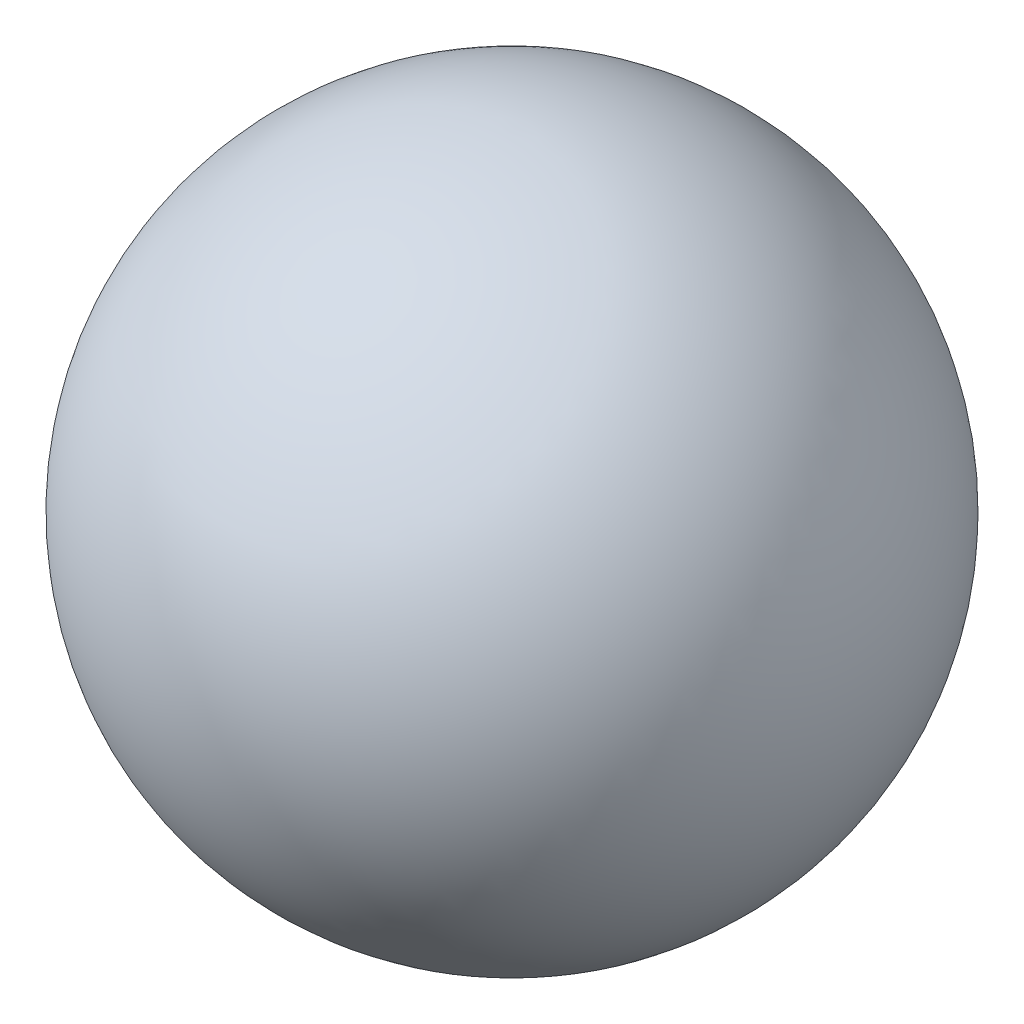
ISO-10303-21;
HEADER;
FILE_DESCRIPTION(('STEP AP214'),'2;1');
FILE_NAME('part.step','',(''),(''),'','','');
FILE_SCHEMA(('AUTOMOTIVE_DESIGN { 1 0 10303 214 1 1 1 1 }'));
ENDSEC;
DATA;
#1=APPLICATION_CONTEXT('core data for automotive mechanical design processes');
#2=APPLICATION_PROTOCOL_DEFINITION('international standard','automotive_design',2000,#1);
#3=PRODUCT_CONTEXT('',#1,'mechanical');
#4=PRODUCT('Part','Part','',(#3));
#5=PRODUCT_RELATED_PRODUCT_CATEGORY('part','',(#4));
#6=PRODUCT_DEFINITION_FORMATION('','',#4);
#7=PRODUCT_DEFINITION_CONTEXT('part definition',#1,'design');
#8=PRODUCT_DEFINITION('design','',#6,#7);
#9=PRODUCT_DEFINITION_SHAPE('','',#8);
#10=(LENGTH_UNIT() NAMED_UNIT(*) SI_UNIT(.MILLI.,.METRE.));
#11=(NAMED_UNIT(*) PLANE_ANGLE_UNIT() SI_UNIT($,.RADIAN.));
#12=(NAMED_UNIT(*) SI_UNIT($,.STERADIAN.) SOLID_ANGLE_UNIT());
#13=UNCERTAINTY_MEASURE_WITH_UNIT(LENGTH_MEASURE(1.E-05),#10,'distance_accuracy_value','');
#14=(GEOMETRIC_REPRESENTATION_CONTEXT(3) GLOBAL_UNCERTAINTY_ASSIGNED_CONTEXT((#13)) GLOBAL_UNIT_ASSIGNED_CONTEXT((#10,
#11,#12)) REPRESENTATION_CONTEXT('',''));
#15=CARTESIAN_POINT('',(0.,0.,0.));
#16=DIRECTION('',(0.,0.,1.));
#17=DIRECTION('',(1.,0.,0.));
#18=AXIS2_PLACEMENT_3D('',#15,#16,#17);
#19=CARTESIAN_POINT('',(0.,0.,0.));
#20=DIRECTION('',(0.,0.999605766854664,0.0280768743078783));
#21=DIRECTION('',(0.,0.0280768743078783,-0.999605766854664));
#22=AXIS2_PLACEMENT_3D('',#19,#20,#21);
#23=SPHERICAL_SURFACE('',#22,51.0847430108636);
#24=CARTESIAN_POINT('',(0.,51.0646037119477,1.43429990856628));
#25=VERTEX_POINT('',#24);
#26=VERTEX_LOOP('',#25);
#27=FACE_BOUND('',#26,.T.);
#28=ADVANCED_FACE('F37',(#27),#23,.T.);
#29=CLOSED_SHELL('',(#28));
#30=MANIFOLD_SOLID_BREP('B2',#29);
#31=ADVANCED_BREP_SHAPE_REPRESENTATION('',(#18,#30),#14);
#32=SHAPE_DEFINITION_REPRESENTATION(#9,#31);
ENDSEC;
END-ISO-10303-21;
